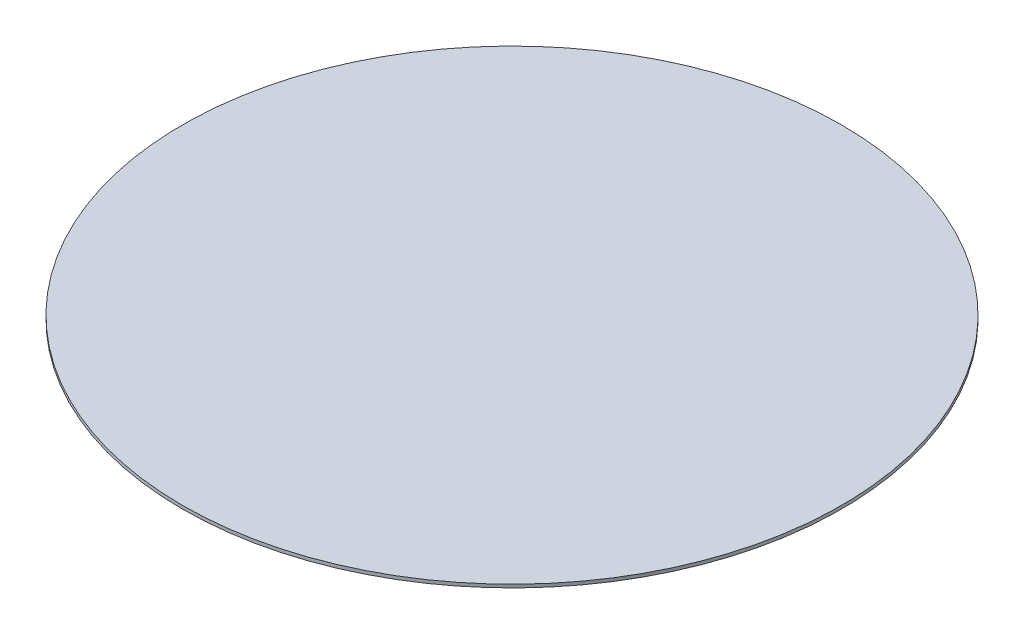
ISO-10303-21;
HEADER;
FILE_DESCRIPTION(('STEP AP214'),'2;1');
FILE_NAME('part.step','',(''),(''),'','','');
FILE_SCHEMA(('AUTOMOTIVE_DESIGN { 1 0 10303 214 1 1 1 1 }'));
ENDSEC;
DATA;
#1=APPLICATION_CONTEXT('core data for automotive mechanical design processes');
#2=APPLICATION_PROTOCOL_DEFINITION('international standard','automotive_design',2000,#1);
#3=PRODUCT_CONTEXT('',#1,'mechanical');
#4=PRODUCT('Part','Part','',(#3));
#5=PRODUCT_RELATED_PRODUCT_CATEGORY('part','',(#4));
#6=PRODUCT_DEFINITION_FORMATION('','',#4);
#7=PRODUCT_DEFINITION_CONTEXT('part definition',#1,'design');
#8=PRODUCT_DEFINITION('design','',#6,#7);
#9=PRODUCT_DEFINITION_SHAPE('','',#8);
#10=(LENGTH_UNIT() NAMED_UNIT(*) SI_UNIT(.MILLI.,.METRE.));
#11=(NAMED_UNIT(*) PLANE_ANGLE_UNIT() SI_UNIT($,.RADIAN.));
#12=(NAMED_UNIT(*) SI_UNIT($,.STERADIAN.) SOLID_ANGLE_UNIT());
#13=UNCERTAINTY_MEASURE_WITH_UNIT(LENGTH_MEASURE(1.E-05),#10,'distance_accuracy_value','');
#14=(GEOMETRIC_REPRESENTATION_CONTEXT(3) GLOBAL_UNCERTAINTY_ASSIGNED_CONTEXT((#13)) GLOBAL_UNIT_ASSIGNED_CONTEXT((#10,
#11,#12)) REPRESENTATION_CONTEXT('',''));
#15=CARTESIAN_POINT('',(0.,0.,0.));
#16=DIRECTION('',(0.,0.,1.));
#17=DIRECTION('',(1.,0.,0.));
#18=AXIS2_PLACEMENT_3D('',#15,#16,#17);
#19=CARTESIAN_POINT('',(0.,6.,0.));
#20=DIRECTION('',(0.,-1.,0.));
#21=DIRECTION('',(0.,0.,-1.));
#22=AXIS2_PLACEMENT_3D('',#19,#20,#21);
#23=CYLINDRICAL_SURFACE('',#22,609.6);
#24=CARTESIAN_POINT('',(0.,6.,0.));
#25=DIRECTION('',(0.,1.,0.));
#26=DIRECTION('',(0.,0.,1.));
#27=AXIS2_PLACEMENT_3D('',#24,#25,#26);
#28=CIRCLE('',#27,609.6);
#29=CARTESIAN_POINT('',(0.,6.,609.6));
#30=VERTEX_POINT('',#29);
#31=EDGE_CURVE('E10',#30,#30,#28,.T.);
#32=ORIENTED_EDGE('',*,*,#31,.F.);
#33=EDGE_LOOP('',(#32));
#34=FACE_BOUND('',#33,.T.);
#35=CARTESIAN_POINT('',(0.,0.,0.));
#36=DIRECTION('',(0.,1.,0.));
#37=DIRECTION('',(0.,0.,1.));
#38=AXIS2_PLACEMENT_3D('',#35,#36,#37);
#39=CIRCLE('',#38,609.6);
#40=CARTESIAN_POINT('',(0.,0.,609.6));
#41=VERTEX_POINT('',#40);
#42=EDGE_CURVE('E46',#41,#41,#39,.T.);
#43=ORIENTED_EDGE('',*,*,#42,.T.);
#44=EDGE_LOOP('',(#43));
#45=FACE_BOUND('',#44,.T.);
#46=ADVANCED_FACE('F43',(#34,#45),#23,.T.);
#47=CARTESIAN_POINT('',(0.,6.,0.));
#48=DIRECTION('',(0.,1.,0.));
#49=DIRECTION('',(0.,0.,1.));
#50=AXIS2_PLACEMENT_3D('',#47,#48,#49);
#51=PLANE('',#50);
#52=ORIENTED_EDGE('',*,*,#31,.T.);
#53=EDGE_LOOP('',(#52));
#54=FACE_BOUND('',#53,.T.);
#55=ADVANCED_FACE('F60',(#54),#51,.T.);
#56=CARTESIAN_POINT('',(0.,0.,0.));
#57=DIRECTION('',(0.,1.,0.));
#58=DIRECTION('',(0.,0.,1.));
#59=AXIS2_PLACEMENT_3D('',#56,#57,#58);
#60=PLANE('',#59);
#61=ORIENTED_EDGE('',*,*,#42,.F.);
#62=EDGE_LOOP('',(#61));
#63=FACE_BOUND('',#62,.T.);
#64=ADVANCED_FACE('F58',(#63),#60,.F.);
#65=CLOSED_SHELL('',(#46,#55,#64));
#66=MANIFOLD_SOLID_BREP('B2',#65);
#67=ADVANCED_BREP_SHAPE_REPRESENTATION('',(#18,#66),#14);
#68=SHAPE_DEFINITION_REPRESENTATION(#9,#67);
ENDSEC;
END-ISO-10303-21;
